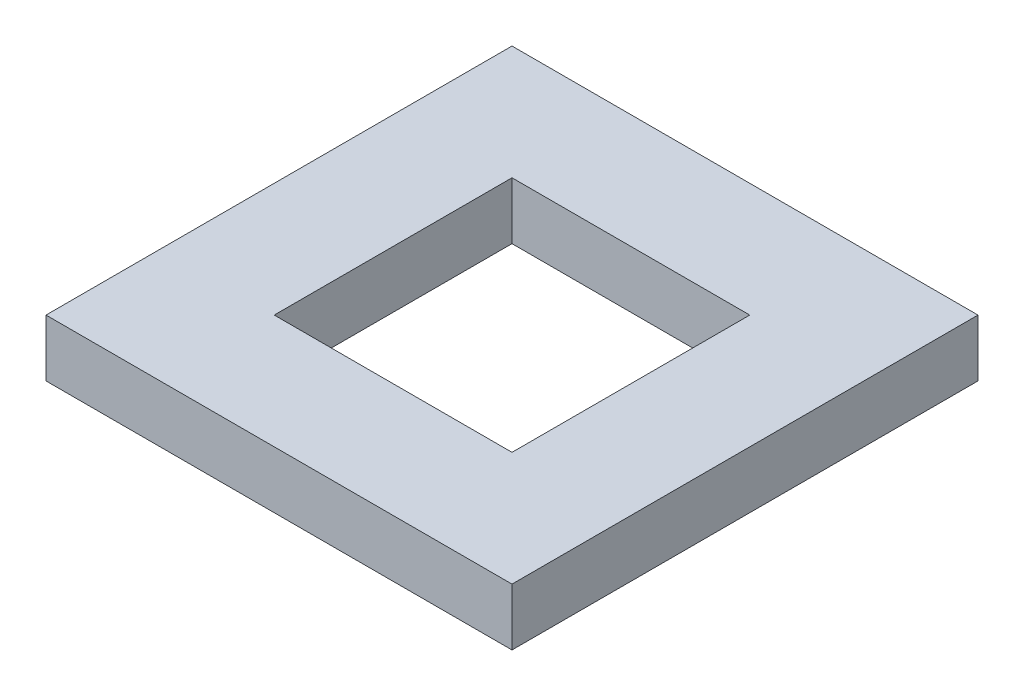
ISO-10303-21;
HEADER;
FILE_DESCRIPTION(('STEP AP214'),'2;1');
FILE_NAME('part.step','',(''),(''),'','','');
FILE_SCHEMA(('AUTOMOTIVE_DESIGN { 1 0 10303 214 1 1 1 1 }'));
ENDSEC;
DATA;
#1=APPLICATION_CONTEXT('core data for automotive mechanical design processes');
#2=APPLICATION_PROTOCOL_DEFINITION('international standard','automotive_design',2000,#1);
#3=PRODUCT_CONTEXT('',#1,'mechanical');
#4=PRODUCT('Part','Part','',(#3));
#5=PRODUCT_RELATED_PRODUCT_CATEGORY('part','',(#4));
#6=PRODUCT_DEFINITION_FORMATION('','',#4);
#7=PRODUCT_DEFINITION_CONTEXT('part definition',#1,'design');
#8=PRODUCT_DEFINITION('design','',#6,#7);
#9=PRODUCT_DEFINITION_SHAPE('','',#8);
#10=(LENGTH_UNIT() NAMED_UNIT(*) SI_UNIT(.MILLI.,.METRE.));
#11=(NAMED_UNIT(*) PLANE_ANGLE_UNIT() SI_UNIT($,.RADIAN.));
#12=(NAMED_UNIT(*) SI_UNIT($,.STERADIAN.) SOLID_ANGLE_UNIT());
#13=UNCERTAINTY_MEASURE_WITH_UNIT(LENGTH_MEASURE(1.E-05),#10,'distance_accuracy_value','');
#14=(GEOMETRIC_REPRESENTATION_CONTEXT(3) GLOBAL_UNCERTAINTY_ASSIGNED_CONTEXT((#13)) GLOBAL_UNIT_ASSIGNED_CONTEXT((#10,
#11,#12)) REPRESENTATION_CONTEXT('',''));
#15=CARTESIAN_POINT('',(0.,0.,0.));
#16=DIRECTION('',(0.,0.,1.));
#17=DIRECTION('',(1.,0.,0.));
#18=AXIS2_PLACEMENT_3D('',#15,#16,#17);
#19=CARTESIAN_POINT('',(0.,3.,0.));
#20=DIRECTION('',(0.,-1.,0.));
#21=DIRECTION('',(0.,0.,-1.));
#22=AXIS2_PLACEMENT_3D('',#19,#20,#21);
#23=PLANE('',#22);
#24=DIRECTION('',(0.,0.,1.));
#25=VECTOR('',#24,1.);
#26=CARTESIAN_POINT('',(0.,3.,0.));
#27=LINE('',#26,#25);
#28=CARTESIAN_POINT('',(0.,3.,-24.5));
#29=VERTEX_POINT('',#28);
#30=CARTESIAN_POINT('',(0.,3.,0.));
#31=VERTEX_POINT('',#30);
#32=EDGE_CURVE('E135',#29,#31,#27,.T.);
#33=ORIENTED_EDGE('',*,*,#32,.T.);
#34=DIRECTION('',(1.,0.,0.));
#35=VECTOR('',#34,1.);
#36=CARTESIAN_POINT('',(0.,3.,0.));
#37=LINE('',#36,#35);
#38=CARTESIAN_POINT('',(24.5,3.,0.));
#39=VERTEX_POINT('',#38);
#40=EDGE_CURVE('E138',#31,#39,#37,.T.);
#41=ORIENTED_EDGE('',*,*,#40,.T.);
#42=DIRECTION('',(0.,0.,-1.));
#43=VECTOR('',#42,1.);
#44=CARTESIAN_POINT('',(24.5,3.,0.));
#45=LINE('',#44,#43);
#46=CARTESIAN_POINT('',(24.5,3.,-24.5));
#47=VERTEX_POINT('',#46);
#48=EDGE_CURVE('E141',#39,#47,#45,.T.);
#49=ORIENTED_EDGE('',*,*,#48,.T.);
#50=DIRECTION('',(-1.,0.,0.));
#51=VECTOR('',#50,1.);
#52=CARTESIAN_POINT('',(0.,3.,-24.5));
#53=LINE('',#52,#51);
#54=EDGE_CURVE('E143',#47,#29,#53,.T.);
#55=ORIENTED_EDGE('',*,*,#54,.T.);
#56=EDGE_LOOP('',(#33,#41,#49,#55));
#57=FACE_BOUND('',#56,.T.);
#58=DIRECTION('',(0.,0.,1.));
#59=VECTOR('',#58,1.);
#60=CARTESIAN_POINT('',(6.,3.,-5.99999999999999));
#61=LINE('',#60,#59);
#62=CARTESIAN_POINT('',(5.99999999999999,3.,-18.5));
#63=VERTEX_POINT('',#62);
#64=CARTESIAN_POINT('',(6.,3.,-5.99999999999999));
#65=VERTEX_POINT('',#64);
#66=EDGE_CURVE('E99',#63,#65,#61,.T.);
#67=ORIENTED_EDGE('',*,*,#66,.F.);
#68=DIRECTION('',(-1.,0.,0.));
#69=VECTOR('',#68,1.);
#70=CARTESIAN_POINT('',(5.99999999999999,3.,-18.5));
#71=LINE('',#70,#69);
#72=CARTESIAN_POINT('',(18.5,3.,-18.5));
#73=VERTEX_POINT('',#72);
#74=EDGE_CURVE('E121',#73,#63,#71,.T.);
#75=ORIENTED_EDGE('',*,*,#74,.F.);
#76=DIRECTION('',(0.,0.,-1.));
#77=VECTOR('',#76,1.);
#78=CARTESIAN_POINT('',(18.5,3.,-6.));
#79=LINE('',#78,#77);
#80=CARTESIAN_POINT('',(18.5,3.,-6.));
#81=VERTEX_POINT('',#80);
#82=EDGE_CURVE('E119',#81,#73,#79,.T.);
#83=ORIENTED_EDGE('',*,*,#82,.F.);
#84=DIRECTION('',(1.,0.,0.));
#85=VECTOR('',#84,1.);
#86=CARTESIAN_POINT('',(6.,3.,-5.99999999999999));
#87=LINE('',#86,#85);
#88=EDGE_CURVE('E107',#65,#81,#87,.T.);
#89=ORIENTED_EDGE('',*,*,#88,.F.);
#90=EDGE_LOOP('',(#67,#75,#83,#89));
#91=FACE_BOUND('',#90,.T.);
#92=ADVANCED_FACE('F34',(#57,#91),#23,.F.);
#93=CARTESIAN_POINT('',(0.,0.,0.));
#94=DIRECTION('',(0.,-1.,0.));
#95=DIRECTION('',(0.,0.,-1.));
#96=AXIS2_PLACEMENT_3D('',#93,#94,#95);
#97=PLANE('',#96);
#98=DIRECTION('',(0.,0.,1.));
#99=VECTOR('',#98,1.);
#100=CARTESIAN_POINT('',(0.,0.,0.));
#101=LINE('',#100,#99);
#102=CARTESIAN_POINT('',(0.,0.,-24.5));
#103=VERTEX_POINT('',#102);
#104=CARTESIAN_POINT('',(0.,0.,0.));
#105=VERTEX_POINT('',#104);
#106=EDGE_CURVE('E115',#103,#105,#101,.T.);
#107=ORIENTED_EDGE('',*,*,#106,.F.);
#108=DIRECTION('',(-1.,0.,0.));
#109=VECTOR('',#108,1.);
#110=CARTESIAN_POINT('',(0.,0.,-24.5));
#111=LINE('',#110,#109);
#112=CARTESIAN_POINT('',(24.5,0.,-24.5));
#113=VERTEX_POINT('',#112);
#114=EDGE_CURVE('E139',#113,#103,#111,.T.);
#115=ORIENTED_EDGE('',*,*,#114,.F.);
#116=DIRECTION('',(0.,0.,-1.));
#117=VECTOR('',#116,1.);
#118=CARTESIAN_POINT('',(24.5,0.,0.));
#119=LINE('',#118,#117);
#120=CARTESIAN_POINT('',(24.5,0.,0.));
#121=VERTEX_POINT('',#120);
#122=EDGE_CURVE('E150',#121,#113,#119,.T.);
#123=ORIENTED_EDGE('',*,*,#122,.F.);
#124=DIRECTION('',(1.,0.,0.));
#125=VECTOR('',#124,1.);
#126=CARTESIAN_POINT('',(0.,0.,0.));
#127=LINE('',#126,#125);
#128=EDGE_CURVE('E148',#105,#121,#127,.T.);
#129=ORIENTED_EDGE('',*,*,#128,.F.);
#130=EDGE_LOOP('',(#107,#115,#123,#129));
#131=FACE_BOUND('',#130,.T.);
#132=DIRECTION('',(-1.,0.,0.));
#133=VECTOR('',#132,1.);
#134=CARTESIAN_POINT('',(5.99999999999999,0.,-18.5));
#135=LINE('',#134,#133);
#136=CARTESIAN_POINT('',(18.5,0.,-18.5));
#137=VERTEX_POINT('',#136);
#138=CARTESIAN_POINT('',(5.99999999999999,0.,-18.5));
#139=VERTEX_POINT('',#138);
#140=EDGE_CURVE('E108',#137,#139,#135,.T.);
#141=ORIENTED_EDGE('',*,*,#140,.T.);
#142=DIRECTION('',(0.,0.,1.));
#143=VECTOR('',#142,1.);
#144=CARTESIAN_POINT('',(6.,0.,-5.99999999999999));
#145=LINE('',#144,#143);
#146=CARTESIAN_POINT('',(6.,0.,-5.99999999999999));
#147=VERTEX_POINT('',#146);
#148=EDGE_CURVE('E57',#139,#147,#145,.T.);
#149=ORIENTED_EDGE('',*,*,#148,.T.);
#150=DIRECTION('',(1.,0.,0.));
#151=VECTOR('',#150,1.);
#152=CARTESIAN_POINT('',(6.,0.,-5.99999999999999));
#153=LINE('',#152,#151);
#154=CARTESIAN_POINT('',(18.5,0.,-6.));
#155=VERTEX_POINT('',#154);
#156=EDGE_CURVE('E114',#147,#155,#153,.T.);
#157=ORIENTED_EDGE('',*,*,#156,.T.);
#158=DIRECTION('',(0.,0.,-1.));
#159=VECTOR('',#158,1.);
#160=CARTESIAN_POINT('',(18.5,0.,-6.));
#161=LINE('',#160,#159);
#162=EDGE_CURVE('E127',#155,#137,#161,.T.);
#163=ORIENTED_EDGE('',*,*,#162,.T.);
#164=EDGE_LOOP('',(#141,#149,#157,#163));
#165=FACE_BOUND('',#164,.T.);
#166=ADVANCED_FACE('F168',(#131,#165),#97,.T.);
#167=CARTESIAN_POINT('',(0.,3.,0.));
#168=DIRECTION('',(1.,0.,0.));
#169=DIRECTION('',(0.,0.,-1.));
#170=AXIS2_PLACEMENT_3D('',#167,#168,#169);
#171=PLANE('',#170);
#172=ORIENTED_EDGE('',*,*,#106,.T.);
#173=DIRECTION('',(0.,-1.,0.));
#174=VECTOR('',#173,1.);
#175=CARTESIAN_POINT('',(0.,3.,0.));
#176=LINE('',#175,#174);
#177=EDGE_CURVE('E11',#31,#105,#176,.T.);
#178=ORIENTED_EDGE('',*,*,#177,.F.);
#179=ORIENTED_EDGE('',*,*,#32,.F.);
#180=DIRECTION('',(0.,-1.,0.));
#181=VECTOR('',#180,1.);
#182=CARTESIAN_POINT('',(0.,3.,-24.5));
#183=LINE('',#182,#181);
#184=EDGE_CURVE('E145',#29,#103,#183,.T.);
#185=ORIENTED_EDGE('',*,*,#184,.T.);
#186=EDGE_LOOP('',(#172,#178,#179,#185));
#187=FACE_BOUND('',#186,.T.);
#188=ADVANCED_FACE('F36',(#187),#171,.F.);
#189=CARTESIAN_POINT('',(0.,3.,0.));
#190=DIRECTION('',(0.,0.,-1.));
#191=DIRECTION('',(-1.,0.,0.));
#192=AXIS2_PLACEMENT_3D('',#189,#190,#191);
#193=PLANE('',#192);
#194=ORIENTED_EDGE('',*,*,#128,.T.);
#195=DIRECTION('',(0.,-1.,0.));
#196=VECTOR('',#195,1.);
#197=CARTESIAN_POINT('',(24.5,3.,0.));
#198=LINE('',#197,#196);
#199=EDGE_CURVE('E42',#39,#121,#198,.T.);
#200=ORIENTED_EDGE('',*,*,#199,.F.);
#201=ORIENTED_EDGE('',*,*,#40,.F.);
#202=ORIENTED_EDGE('',*,*,#177,.T.);
#203=EDGE_LOOP('',(#194,#200,#201,#202));
#204=FACE_BOUND('',#203,.T.);
#205=ADVANCED_FACE('F178',(#204),#193,.F.);
#206=CARTESIAN_POINT('',(24.5,3.,0.));
#207=DIRECTION('',(-1.,0.,0.));
#208=DIRECTION('',(0.,0.,1.));
#209=AXIS2_PLACEMENT_3D('',#206,#207,#208);
#210=PLANE('',#209);
#211=ORIENTED_EDGE('',*,*,#122,.T.);
#212=DIRECTION('',(0.,-1.,0.));
#213=VECTOR('',#212,1.);
#214=CARTESIAN_POINT('',(24.5,3.,-24.5));
#215=LINE('',#214,#213);
#216=EDGE_CURVE('E155',#47,#113,#215,.T.);
#217=ORIENTED_EDGE('',*,*,#216,.F.);
#218=ORIENTED_EDGE('',*,*,#48,.F.);
#219=ORIENTED_EDGE('',*,*,#199,.T.);
#220=EDGE_LOOP('',(#211,#217,#218,#219));
#221=FACE_BOUND('',#220,.T.);
#222=ADVANCED_FACE('F162',(#221),#210,.F.);
#223=CARTESIAN_POINT('',(0.,3.,-24.5));
#224=DIRECTION('',(0.,0.,1.));
#225=DIRECTION('',(1.,0.,0.));
#226=AXIS2_PLACEMENT_3D('',#223,#224,#225);
#227=PLANE('',#226);
#228=ORIENTED_EDGE('',*,*,#114,.T.);
#229=ORIENTED_EDGE('',*,*,#184,.F.);
#230=ORIENTED_EDGE('',*,*,#54,.F.);
#231=ORIENTED_EDGE('',*,*,#216,.T.);
#232=EDGE_LOOP('',(#228,#229,#230,#231));
#233=FACE_BOUND('',#232,.T.);
#234=ADVANCED_FACE('F172',(#233),#227,.F.);
#235=CARTESIAN_POINT('',(6.,3.,-5.99999999999999));
#236=DIRECTION('',(1.,0.,0.));
#237=DIRECTION('',(0.,0.,-1.));
#238=AXIS2_PLACEMENT_3D('',#235,#236,#237);
#239=PLANE('',#238);
#240=ORIENTED_EDGE('',*,*,#148,.F.);
#241=DIRECTION('',(0.,-1.,0.));
#242=VECTOR('',#241,1.);
#243=CARTESIAN_POINT('',(5.99999999999999,3.,-18.5));
#244=LINE('',#243,#242);
#245=EDGE_CURVE('E103',#63,#139,#244,.T.);
#246=ORIENTED_EDGE('',*,*,#245,.F.);
#247=ORIENTED_EDGE('',*,*,#66,.T.);
#248=DIRECTION('',(0.,-1.,0.));
#249=VECTOR('',#248,1.);
#250=CARTESIAN_POINT('',(6.,3.,-5.99999999999999));
#251=LINE('',#250,#249);
#252=EDGE_CURVE('E102',#65,#147,#251,.T.);
#253=ORIENTED_EDGE('',*,*,#252,.T.);
#254=EDGE_LOOP('',(#240,#246,#247,#253));
#255=FACE_BOUND('',#254,.T.);
#256=ADVANCED_FACE('F101',(#255),#239,.T.);
#257=CARTESIAN_POINT('',(6.,3.,-5.99999999999999));
#258=DIRECTION('',(0.,0.,-1.));
#259=DIRECTION('',(-1.,0.,0.));
#260=AXIS2_PLACEMENT_3D('',#257,#258,#259);
#261=PLANE('',#260);
#262=ORIENTED_EDGE('',*,*,#156,.F.);
#263=ORIENTED_EDGE('',*,*,#252,.F.);
#264=ORIENTED_EDGE('',*,*,#88,.T.);
#265=DIRECTION('',(0.,-1.,0.));
#266=VECTOR('',#265,1.);
#267=CARTESIAN_POINT('',(18.5,3.,-6.));
#268=LINE('',#267,#266);
#269=EDGE_CURVE('E116',#81,#155,#268,.T.);
#270=ORIENTED_EDGE('',*,*,#269,.T.);
#271=EDGE_LOOP('',(#262,#263,#264,#270));
#272=FACE_BOUND('',#271,.T.);
#273=ADVANCED_FACE('F111',(#272),#261,.T.);
#274=CARTESIAN_POINT('',(18.5,3.,-6.));
#275=DIRECTION('',(-1.,0.,0.));
#276=DIRECTION('',(0.,0.,1.));
#277=AXIS2_PLACEMENT_3D('',#274,#275,#276);
#278=PLANE('',#277);
#279=ORIENTED_EDGE('',*,*,#162,.F.);
#280=ORIENTED_EDGE('',*,*,#269,.F.);
#281=ORIENTED_EDGE('',*,*,#82,.T.);
#282=DIRECTION('',(0.,-1.,0.));
#283=VECTOR('',#282,1.);
#284=CARTESIAN_POINT('',(18.5,3.,-18.5));
#285=LINE('',#284,#283);
#286=EDGE_CURVE('E49',#73,#137,#285,.T.);
#287=ORIENTED_EDGE('',*,*,#286,.T.);
#288=EDGE_LOOP('',(#279,#280,#281,#287));
#289=FACE_BOUND('',#288,.T.);
#290=ADVANCED_FACE('F201',(#289),#278,.T.);
#291=CARTESIAN_POINT('',(5.99999999999999,3.,-18.5));
#292=DIRECTION('',(0.,0.,1.));
#293=DIRECTION('',(1.,0.,0.));
#294=AXIS2_PLACEMENT_3D('',#291,#292,#293);
#295=PLANE('',#294);
#296=ORIENTED_EDGE('',*,*,#140,.F.);
#297=ORIENTED_EDGE('',*,*,#286,.F.);
#298=ORIENTED_EDGE('',*,*,#74,.T.);
#299=ORIENTED_EDGE('',*,*,#245,.T.);
#300=EDGE_LOOP('',(#296,#297,#298,#299));
#301=FACE_BOUND('',#300,.T.);
#302=ADVANCED_FACE('F205',(#301),#295,.T.);
#303=CLOSED_SHELL('',(#92,#166,#188,#205,#222,#234,#256,#273,#290,#302));
#304=MANIFOLD_SOLID_BREP('B2',#303);
#305=ADVANCED_BREP_SHAPE_REPRESENTATION('',(#18,#304),#14);
#306=SHAPE_DEFINITION_REPRESENTATION(#9,#305);
ENDSEC;
END-ISO-10303-21;
